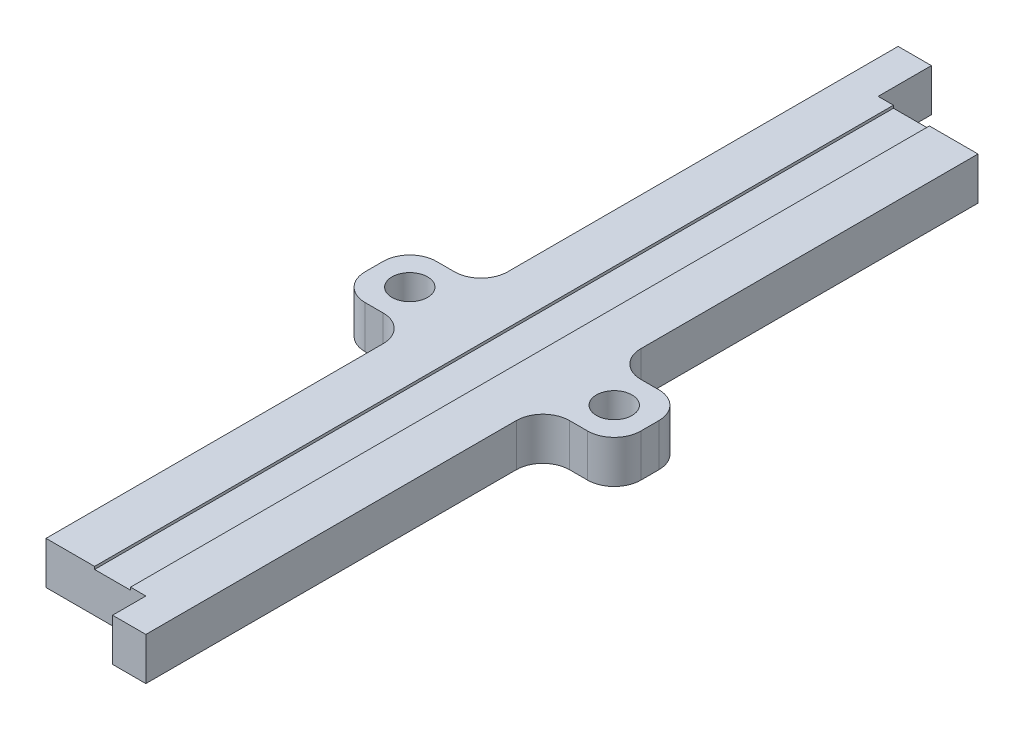
ISO-10303-21;
HEADER;
FILE_DESCRIPTION(('STEP AP214'),'2;1');
FILE_NAME('part.step','',(''),(''),'','','');
FILE_SCHEMA(('AUTOMOTIVE_DESIGN { 1 0 10303 214 1 1 1 1 }'));
ENDSEC;
DATA;
#1=APPLICATION_CONTEXT('core data for automotive mechanical design processes');
#2=APPLICATION_PROTOCOL_DEFINITION('international standard','automotive_design',2000,#1);
#3=PRODUCT_CONTEXT('',#1,'mechanical');
#4=PRODUCT('Part','Part','',(#3));
#5=PRODUCT_RELATED_PRODUCT_CATEGORY('part','',(#4));
#6=PRODUCT_DEFINITION_FORMATION('','',#4);
#7=PRODUCT_DEFINITION_CONTEXT('part definition',#1,'design');
#8=PRODUCT_DEFINITION('design','',#6,#7);
#9=PRODUCT_DEFINITION_SHAPE('','',#8);
#10=(LENGTH_UNIT() NAMED_UNIT(*) SI_UNIT(.MILLI.,.METRE.));
#11=(NAMED_UNIT(*) PLANE_ANGLE_UNIT() SI_UNIT($,.RADIAN.));
#12=(NAMED_UNIT(*) SI_UNIT($,.STERADIAN.) SOLID_ANGLE_UNIT());
#13=UNCERTAINTY_MEASURE_WITH_UNIT(LENGTH_MEASURE(1.E-05),#10,'distance_accuracy_value','');
#14=(GEOMETRIC_REPRESENTATION_CONTEXT(3) GLOBAL_UNCERTAINTY_ASSIGNED_CONTEXT((#13)) GLOBAL_UNIT_ASSIGNED_CONTEXT((#10,
#11,#12)) REPRESENTATION_CONTEXT('',''));
#15=CARTESIAN_POINT('',(0.,0.,0.));
#16=DIRECTION('',(0.,0.,1.));
#17=DIRECTION('',(1.,0.,0.));
#18=AXIS2_PLACEMENT_3D('',#15,#16,#17);
#19=CARTESIAN_POINT('',(6.35,-2.032,228.6));
#20=DIRECTION('',(-1.,0.,0.));
#21=DIRECTION('',(0.,0.,1.));
#22=AXIS2_PLACEMENT_3D('',#19,#20,#21);
#23=PLANE('',#22);
#24=DIRECTION('',(0.,0.,-1.));
#25=VECTOR('',#24,1.);
#26=CARTESIAN_POINT('',(6.35,2.032,228.6));
#27=LINE('',#26,#25);
#28=CARTESIAN_POINT('',(6.35,2.032,108.35894));
#29=VERTEX_POINT('',#28);
#30=CARTESIAN_POINT('',(6.35,2.032,76.2));
#31=VERTEX_POINT('',#30);
#32=EDGE_CURVE('E274',#29,#31,#27,.T.);
#33=ORIENTED_EDGE('',*,*,#32,.F.);
#34=DIRECTION('',(0.,1.,0.));
#35=VECTOR('',#34,1.);
#36=CARTESIAN_POINT('',(6.35,-2.032,108.35894));
#37=LINE('',#36,#35);
#38=CARTESIAN_POINT('',(6.35,-2.032,108.35894));
#39=VERTEX_POINT('',#38);
#40=EDGE_CURVE('E277',#29,#39,#37,.F.);
#41=ORIENTED_EDGE('',*,*,#40,.T.);
#42=DIRECTION('',(0.,0.,-1.));
#43=VECTOR('',#42,1.);
#44=CARTESIAN_POINT('',(6.35,-2.032,228.6));
#45=LINE('',#44,#43);
#46=CARTESIAN_POINT('',(6.35,-2.032,76.2));
#47=VERTEX_POINT('',#46);
#48=EDGE_CURVE('E249',#39,#47,#45,.T.);
#49=ORIENTED_EDGE('',*,*,#48,.T.);
#50=DIRECTION('',(0.,1.,0.));
#51=VECTOR('',#50,1.);
#52=CARTESIAN_POINT('',(6.35,-2.032,76.2));
#53=LINE('',#52,#51);
#54=EDGE_CURVE('E412',#47,#31,#53,.T.);
#55=ORIENTED_EDGE('',*,*,#54,.T.);
#56=EDGE_LOOP('',(#33,#41,#49,#55));
#57=FACE_BOUND('',#56,.T.);
#58=ADVANCED_FACE('F33',(#57),#23,.F.);
#59=CARTESIAN_POINT('',(-6.35,-2.032,228.6));
#60=DIRECTION('',(1.,0.,0.));
#61=DIRECTION('',(0.,0.,-1.));
#62=AXIS2_PLACEMENT_3D('',#59,#60,#61);
#63=PLANE('',#62);
#64=DIRECTION('',(0.,0.,-1.));
#65=VECTOR('',#64,1.);
#66=CARTESIAN_POINT('',(-6.35,2.032,228.6));
#67=LINE('',#66,#65);
#68=CARTESIAN_POINT('',(-6.34999999999997,2.032,152.4));
#69=VERTEX_POINT('',#68);
#70=CARTESIAN_POINT('',(-6.35,2.032,120.24106));
#71=VERTEX_POINT('',#70);
#72=EDGE_CURVE('E276',#69,#71,#67,.T.);
#73=ORIENTED_EDGE('',*,*,#72,.T.);
#74=DIRECTION('',(0.,1.,0.));
#75=VECTOR('',#74,1.);
#76=CARTESIAN_POINT('',(-6.35,-2.032,120.24106));
#77=LINE('',#76,#75);
#78=CARTESIAN_POINT('',(-6.35,-2.032,120.24106));
#79=VERTEX_POINT('',#78);
#80=EDGE_CURVE('E348',#71,#79,#77,.F.);
#81=ORIENTED_EDGE('',*,*,#80,.T.);
#82=DIRECTION('',(0.,0.,-1.));
#83=VECTOR('',#82,1.);
#84=CARTESIAN_POINT('',(-6.35,-2.032,228.6));
#85=LINE('',#84,#83);
#86=CARTESIAN_POINT('',(-6.34999999999997,-2.032,152.4));
#87=VERTEX_POINT('',#86);
#88=EDGE_CURVE('E251',#87,#79,#85,.T.);
#89=ORIENTED_EDGE('',*,*,#88,.F.);
#90=DIRECTION('',(0.,1.,0.));
#91=VECTOR('',#90,1.);
#92=CARTESIAN_POINT('',(-6.34999999999997,-2.032,152.4));
#93=LINE('',#92,#91);
#94=EDGE_CURVE('E381',#87,#69,#93,.T.);
#95=ORIENTED_EDGE('',*,*,#94,.T.);
#96=EDGE_LOOP('',(#73,#81,#89,#95));
#97=FACE_BOUND('',#96,.T.);
#98=ADVANCED_FACE('F551',(#97),#63,.F.);
#99=CARTESIAN_POINT('',(-6.35,2.032,228.6));
#100=DIRECTION('',(0.,-1.,0.));
#101=DIRECTION('',(0.,0.,-1.));
#102=AXIS2_PLACEMENT_3D('',#99,#100,#101);
#103=PLANE('',#102);
#104=DIRECTION('',(0.,0.,1.));
#105=VECTOR('',#104,1.);
#106=CARTESIAN_POINT('',(-13.1521199999999,2.032,0.));
#107=LINE('',#106,#105);
#108=CARTESIAN_POINT('',(-13.15212,2.032,113.43894));
#109=VERTEX_POINT('',#108);
#110=CARTESIAN_POINT('',(-13.15212,2.032,115.16106));
#111=VERTEX_POINT('',#110);
#112=EDGE_CURVE('E302',#109,#111,#107,.T.);
#113=ORIENTED_EDGE('',*,*,#112,.T.);
#114=CARTESIAN_POINT('',(-10.61212,2.032,115.16106));
#115=DIRECTION('',(0.,-1.,0.));
#116=DIRECTION('',(0.,0.,-1.));
#117=AXIS2_PLACEMENT_3D('',#114,#115,#116);
#118=CIRCLE('',#117,2.54);
#119=CARTESIAN_POINT('',(-10.61212,2.032,117.70106));
#120=VERTEX_POINT('',#119);
#121=EDGE_CURVE('E306',#111,#120,#118,.F.);
#122=ORIENTED_EDGE('',*,*,#121,.T.);
#123=DIRECTION('',(-1.,0.,0.));
#124=VECTOR('',#123,1.);
#125=CARTESIAN_POINT('',(0.,2.032,117.70106));
#126=LINE('',#125,#124);
#127=CARTESIAN_POINT('',(-8.89,2.032,117.70106));
#128=VERTEX_POINT('',#127);
#129=EDGE_CURVE('E367',#128,#120,#126,.T.);
#130=ORIENTED_EDGE('',*,*,#129,.F.);
#131=CARTESIAN_POINT('',(-8.89,2.032,120.24106));
#132=DIRECTION('',(0.,-1.,0.));
#133=DIRECTION('',(0.,0.,-1.));
#134=AXIS2_PLACEMENT_3D('',#131,#132,#133);
#135=CIRCLE('',#134,2.54);
#136=EDGE_CURVE('E323',#128,#71,#135,.T.);
#137=ORIENTED_EDGE('',*,*,#136,.T.);
#138=ORIENTED_EDGE('',*,*,#72,.F.);
#139=DIRECTION('',(-1.,0.,0.));
#140=VECTOR('',#139,1.);
#141=CARTESIAN_POINT('',(-6.34999999999997,2.032,152.4));
#142=LINE('',#141,#140);
#143=CARTESIAN_POINT('',(-1.7145,2.032,152.4));
#144=VERTEX_POINT('',#143);
#145=EDGE_CURVE('E379',#144,#69,#142,.T.);
#146=ORIENTED_EDGE('',*,*,#145,.F.);
#147=DIRECTION('',(0.,0.,1.));
#148=VECTOR('',#147,1.);
#149=CARTESIAN_POINT('',(-1.7145,2.032,5.6134));
#150=LINE('',#149,#148);
#151=CARTESIAN_POINT('',(-1.7145,2.032,76.2));
#152=VERTEX_POINT('',#151);
#153=EDGE_CURVE('E427',#152,#144,#150,.T.);
#154=ORIENTED_EDGE('',*,*,#153,.F.);
#155=DIRECTION('',(1.,0.,0.));
#156=VECTOR('',#155,1.);
#157=CARTESIAN_POINT('',(-3.17499999999998,2.032,76.2));
#158=LINE('',#157,#156);
#159=CARTESIAN_POINT('',(-3.17499999999998,2.032,76.2));
#160=VERTEX_POINT('',#159);
#161=EDGE_CURVE('E398',#160,#152,#158,.T.);
#162=ORIENTED_EDGE('',*,*,#161,.F.);
#163=DIRECTION('',(0.,0.,1.));
#164=VECTOR('',#163,1.);
#165=CARTESIAN_POINT('',(-3.17499999999998,2.032,71.12));
#166=LINE('',#165,#164);
#167=CARTESIAN_POINT('',(-3.17499999999998,2.032,71.12));
#168=VERTEX_POINT('',#167);
#169=EDGE_CURVE('E407',#168,#160,#166,.T.);
#170=ORIENTED_EDGE('',*,*,#169,.F.);
#171=DIRECTION('',(1.,0.,0.));
#172=VECTOR('',#171,1.);
#173=CARTESIAN_POINT('',(-6.34999999999998,2.032,71.12));
#174=LINE('',#173,#172);
#175=CARTESIAN_POINT('',(-6.34999999999998,2.032,71.12));
#176=VERTEX_POINT('',#175);
#177=EDGE_CURVE('E393',#176,#168,#174,.T.);
#178=ORIENTED_EDGE('',*,*,#177,.F.);
#179=CARTESIAN_POINT('',(-6.35,2.032,108.35894));
#180=VERTEX_POINT('',#179);
#181=EDGE_CURVE('E291',#180,#176,#67,.T.);
#182=ORIENTED_EDGE('',*,*,#181,.F.);
#183=CARTESIAN_POINT('',(-8.89,2.032,108.35894));
#184=DIRECTION('',(0.,-1.,0.));
#185=DIRECTION('',(0.,0.,-1.));
#186=AXIS2_PLACEMENT_3D('',#183,#184,#185);
#187=CIRCLE('',#186,2.54);
#188=CARTESIAN_POINT('',(-8.89,2.032,110.89894));
#189=VERTEX_POINT('',#188);
#190=EDGE_CURVE('E41',#180,#189,#187,.T.);
#191=ORIENTED_EDGE('',*,*,#190,.T.);
#192=DIRECTION('',(-1.,0.,0.));
#193=VECTOR('',#192,1.);
#194=CARTESIAN_POINT('',(0.,2.032,110.89894));
#195=LINE('',#194,#193);
#196=CARTESIAN_POINT('',(-10.61212,2.032,110.89894));
#197=VERTEX_POINT('',#196);
#198=EDGE_CURVE('E299',#189,#197,#195,.T.);
#199=ORIENTED_EDGE('',*,*,#198,.T.);
#200=CARTESIAN_POINT('',(-10.61212,2.032,113.43894));
#201=DIRECTION('',(0.,-1.,0.));
#202=DIRECTION('',(0.,0.,-1.));
#203=AXIS2_PLACEMENT_3D('',#200,#201,#202);
#204=CIRCLE('',#203,2.54);
#205=EDGE_CURVE('E48',#197,#109,#204,.F.);
#206=ORIENTED_EDGE('',*,*,#205,.T.);
#207=EDGE_LOOP('',(#113,#122,#130,#137,#138,#146,#154,#162,#170,#178,#182,#191,#199,#206));
#208=FACE_BOUND('',#207,.T.);
#209=CARTESIAN_POINT('',(-9.75105999999997,2.032,114.3));
#210=DIRECTION('',(0.,1.,0.));
#211=DIRECTION('',(0.,0.,1.));
#212=AXIS2_PLACEMENT_3D('',#209,#210,#211);
#213=CIRCLE('',#212,1.70052999999999);
#214=CARTESIAN_POINT('',(-9.75105999999997,2.032,116.00053));
#215=VERTEX_POINT('',#214);
#216=EDGE_CURVE('E303',#215,#215,#213,.T.);
#217=ORIENTED_EDGE('',*,*,#216,.F.);
#218=EDGE_LOOP('',(#217));
#219=FACE_BOUND('',#218,.T.);
#220=ADVANCED_FACE('F365',(#208,#219),#103,.F.);
#221=DIRECTION('',(0.,0.,1.));
#222=VECTOR('',#221,1.);
#223=CARTESIAN_POINT('',(13.1521199999999,2.032,0.));
#224=LINE('',#223,#222);
#225=CARTESIAN_POINT('',(13.15212,2.032,113.43894));
#226=VERTEX_POINT('',#225);
#227=CARTESIAN_POINT('',(13.15212,2.032,115.16106));
#228=VERTEX_POINT('',#227);
#229=EDGE_CURVE('E510',#226,#228,#224,.T.);
#230=ORIENTED_EDGE('',*,*,#229,.F.);
#231=CARTESIAN_POINT('',(10.61212,2.032,113.43894));
#232=DIRECTION('',(0.,-1.,0.));
#233=DIRECTION('',(0.,0.,-1.));
#234=AXIS2_PLACEMENT_3D('',#231,#232,#233);
#235=CIRCLE('',#234,2.54);
#236=CARTESIAN_POINT('',(10.61212,2.032,110.89894));
#237=VERTEX_POINT('',#236);
#238=EDGE_CURVE('E485',#226,#237,#235,.F.);
#239=ORIENTED_EDGE('',*,*,#238,.T.);
#240=DIRECTION('',(1.,0.,0.));
#241=VECTOR('',#240,1.);
#242=CARTESIAN_POINT('',(0.,2.032,110.89894));
#243=LINE('',#242,#241);
#244=CARTESIAN_POINT('',(8.89,2.032,110.89894));
#245=VERTEX_POINT('',#244);
#246=EDGE_CURVE('E472',#245,#237,#243,.T.);
#247=ORIENTED_EDGE('',*,*,#246,.F.);
#248=CARTESIAN_POINT('',(8.89,2.032,108.35894));
#249=DIRECTION('',(0.,-1.,0.));
#250=DIRECTION('',(0.,0.,-1.));
#251=AXIS2_PLACEMENT_3D('',#248,#249,#250);
#252=CIRCLE('',#251,2.54);
#253=EDGE_CURVE('E316',#245,#29,#252,.T.);
#254=ORIENTED_EDGE('',*,*,#253,.T.);
#255=ORIENTED_EDGE('',*,*,#32,.T.);
#256=CARTESIAN_POINT('',(1.7145,2.032,76.2));
#257=VERTEX_POINT('',#256);
#258=EDGE_CURVE('E410',#257,#31,#158,.T.);
#259=ORIENTED_EDGE('',*,*,#258,.F.);
#260=DIRECTION('',(0.,0.,-1.));
#261=VECTOR('',#260,1.);
#262=CARTESIAN_POINT('',(1.7145,2.032,5.61339999999999));
#263=LINE('',#262,#261);
#264=CARTESIAN_POINT('',(1.7145,2.032,152.4));
#265=VERTEX_POINT('',#264);
#266=EDGE_CURVE('E265',#265,#257,#263,.T.);
#267=ORIENTED_EDGE('',*,*,#266,.F.);
#268=CARTESIAN_POINT('',(3.17499999999999,2.032,152.4));
#269=VERTEX_POINT('',#268);
#270=EDGE_CURVE('E229',#269,#265,#142,.T.);
#271=ORIENTED_EDGE('',*,*,#270,.F.);
#272=DIRECTION('',(0.,0.,-1.));
#273=VECTOR('',#272,1.);
#274=CARTESIAN_POINT('',(3.17499999999999,2.032,152.4));
#275=LINE('',#274,#273);
#276=CARTESIAN_POINT('',(3.17499999999999,2.032,155.575));
#277=VERTEX_POINT('',#276);
#278=EDGE_CURVE('E376',#277,#269,#275,.T.);
#279=ORIENTED_EDGE('',*,*,#278,.F.);
#280=DIRECTION('',(-1.,0.,0.));
#281=VECTOR('',#280,1.);
#282=CARTESIAN_POINT('',(3.17499999999999,2.032,155.575));
#283=LINE('',#282,#281);
#284=CARTESIAN_POINT('',(6.34999999999999,2.032,155.575));
#285=VERTEX_POINT('',#284);
#286=EDGE_CURVE('E344',#285,#277,#283,.T.);
#287=ORIENTED_EDGE('',*,*,#286,.F.);
#288=CARTESIAN_POINT('',(6.35,2.032,120.24106));
#289=VERTEX_POINT('',#288);
#290=EDGE_CURVE('E239',#285,#289,#27,.T.);
#291=ORIENTED_EDGE('',*,*,#290,.T.);
#292=CARTESIAN_POINT('',(8.89,2.032,120.24106));
#293=DIRECTION('',(0.,-1.,0.));
#294=DIRECTION('',(0.,0.,-1.));
#295=AXIS2_PLACEMENT_3D('',#292,#293,#294);
#296=CIRCLE('',#295,2.54);
#297=CARTESIAN_POINT('',(8.89,2.032,117.70106));
#298=VERTEX_POINT('',#297);
#299=EDGE_CURVE('E320',#289,#298,#296,.T.);
#300=ORIENTED_EDGE('',*,*,#299,.T.);
#301=DIRECTION('',(1.,0.,0.));
#302=VECTOR('',#301,1.);
#303=CARTESIAN_POINT('',(0.,2.032,117.70106));
#304=LINE('',#303,#302);
#305=CARTESIAN_POINT('',(10.61212,2.032,117.70106));
#306=VERTEX_POINT('',#305);
#307=EDGE_CURVE('E513',#298,#306,#304,.T.);
#308=ORIENTED_EDGE('',*,*,#307,.T.);
#309=CARTESIAN_POINT('',(10.61212,2.032,115.16106));
#310=DIRECTION('',(0.,-1.,0.));
#311=DIRECTION('',(0.,0.,-1.));
#312=AXIS2_PLACEMENT_3D('',#309,#310,#311);
#313=CIRCLE('',#312,2.54);
#314=EDGE_CURVE('E528',#306,#228,#313,.F.);
#315=ORIENTED_EDGE('',*,*,#314,.T.);
#316=EDGE_LOOP('',(#230,#239,#247,#254,#255,#259,#267,#271,#279,#287,#291,#300,#308,#315));
#317=FACE_BOUND('',#316,.T.);
#318=CARTESIAN_POINT('',(9.75105999999997,2.032,114.3));
#319=DIRECTION('',(0.,1.,0.));
#320=DIRECTION('',(0.,0.,1.));
#321=AXIS2_PLACEMENT_3D('',#318,#319,#320);
#322=CIRCLE('',#321,1.70052999999999);
#323=CARTESIAN_POINT('',(9.75105999999997,2.032,116.00053));
#324=VERTEX_POINT('',#323);
#325=EDGE_CURVE('E471',#324,#324,#322,.F.);
#326=ORIENTED_EDGE('',*,*,#325,.T.);
#327=EDGE_LOOP('',(#326));
#328=FACE_BOUND('',#327,.T.);
#329=ADVANCED_FACE('F448',(#317,#328),#103,.F.);
#330=CARTESIAN_POINT('',(-6.35,-2.032,228.6));
#331=DIRECTION('',(0.,1.,0.));
#332=DIRECTION('',(0.,0.,1.));
#333=AXIS2_PLACEMENT_3D('',#330,#331,#332);
#334=PLANE('',#333);
#335=DIRECTION('',(1.,0.,0.));
#336=VECTOR('',#335,1.);
#337=CARTESIAN_POINT('',(0.,-2.032,110.89894));
#338=LINE('',#337,#336);
#339=CARTESIAN_POINT('',(8.89,-2.032,110.89894));
#340=VERTEX_POINT('',#339);
#341=CARTESIAN_POINT('',(10.61212,-2.032,110.89894));
#342=VERTEX_POINT('',#341);
#343=EDGE_CURVE('E467',#340,#342,#338,.T.);
#344=ORIENTED_EDGE('',*,*,#343,.T.);
#345=CARTESIAN_POINT('',(10.61212,-2.032,113.43894));
#346=DIRECTION('',(0.,1.,0.));
#347=DIRECTION('',(0.,0.,1.));
#348=AXIS2_PLACEMENT_3D('',#345,#346,#347);
#349=CIRCLE('',#348,2.54);
#350=CARTESIAN_POINT('',(13.15212,-2.032,113.43894));
#351=VERTEX_POINT('',#350);
#352=EDGE_CURVE('E489',#342,#351,#349,.F.);
#353=ORIENTED_EDGE('',*,*,#352,.T.);
#354=DIRECTION('',(0.,0.,1.));
#355=VECTOR('',#354,1.);
#356=CARTESIAN_POINT('',(13.1521199999999,-2.032,0.));
#357=LINE('',#356,#355);
#358=CARTESIAN_POINT('',(13.15212,-2.032,115.16106));
#359=VERTEX_POINT('',#358);
#360=EDGE_CURVE('E480',#351,#359,#357,.T.);
#361=ORIENTED_EDGE('',*,*,#360,.T.);
#362=CARTESIAN_POINT('',(10.61212,-2.032,115.16106));
#363=DIRECTION('',(0.,1.,0.));
#364=DIRECTION('',(0.,0.,1.));
#365=AXIS2_PLACEMENT_3D('',#362,#363,#364);
#366=CIRCLE('',#365,2.54);
#367=CARTESIAN_POINT('',(10.61212,-2.032,117.70106));
#368=VERTEX_POINT('',#367);
#369=EDGE_CURVE('E487',#359,#368,#366,.F.);
#370=ORIENTED_EDGE('',*,*,#369,.T.);
#371=DIRECTION('',(1.,0.,0.));
#372=VECTOR('',#371,1.);
#373=CARTESIAN_POINT('',(0.,-2.032,117.70106));
#374=LINE('',#373,#372);
#375=CARTESIAN_POINT('',(8.89,-2.032,117.70106));
#376=VERTEX_POINT('',#375);
#377=EDGE_CURVE('E470',#376,#368,#374,.T.);
#378=ORIENTED_EDGE('',*,*,#377,.F.);
#379=CARTESIAN_POINT('',(8.89,-2.032,120.24106));
#380=DIRECTION('',(0.,1.,0.));
#381=DIRECTION('',(0.,0.,1.));
#382=AXIS2_PLACEMENT_3D('',#379,#380,#381);
#383=CIRCLE('',#382,2.54);
#384=CARTESIAN_POINT('',(6.35,-2.032,120.24106));
#385=VERTEX_POINT('',#384);
#386=EDGE_CURVE('E247',#376,#385,#383,.T.);
#387=ORIENTED_EDGE('',*,*,#386,.T.);
#388=CARTESIAN_POINT('',(6.34999999999999,-2.032,155.575));
#389=VERTEX_POINT('',#388);
#390=EDGE_CURVE('E236',#389,#385,#45,.T.);
#391=ORIENTED_EDGE('',*,*,#390,.F.);
#392=DIRECTION('',(-1.,0.,0.));
#393=VECTOR('',#392,1.);
#394=CARTESIAN_POINT('',(3.17499999999999,-2.032,155.575));
#395=LINE('',#394,#393);
#396=CARTESIAN_POINT('',(3.17499999999999,-2.032,155.575));
#397=VERTEX_POINT('',#396);
#398=EDGE_CURVE('E217',#389,#397,#395,.T.);
#399=ORIENTED_EDGE('',*,*,#398,.T.);
#400=DIRECTION('',(0.,0.,-1.));
#401=VECTOR('',#400,1.);
#402=CARTESIAN_POINT('',(3.17499999999999,-2.032,152.4));
#403=LINE('',#402,#401);
#404=CARTESIAN_POINT('',(3.17499999999999,-2.032,152.4));
#405=VERTEX_POINT('',#404);
#406=EDGE_CURVE('E228',#397,#405,#403,.T.);
#407=ORIENTED_EDGE('',*,*,#406,.T.);
#408=DIRECTION('',(-1.,0.,0.));
#409=VECTOR('',#408,1.);
#410=CARTESIAN_POINT('',(-6.34999999999997,-2.032,152.4));
#411=LINE('',#410,#409);
#412=EDGE_CURVE('E240',#405,#87,#411,.T.);
#413=ORIENTED_EDGE('',*,*,#412,.T.);
#414=ORIENTED_EDGE('',*,*,#88,.T.);
#415=CARTESIAN_POINT('',(-8.89,-2.032,120.24106));
#416=DIRECTION('',(0.,1.,0.));
#417=DIRECTION('',(0.,0.,1.));
#418=AXIS2_PLACEMENT_3D('',#415,#416,#417);
#419=CIRCLE('',#418,2.54);
#420=CARTESIAN_POINT('',(-8.89,-2.032,117.70106));
#421=VERTEX_POINT('',#420);
#422=EDGE_CURVE('E325',#79,#421,#419,.T.);
#423=ORIENTED_EDGE('',*,*,#422,.T.);
#424=DIRECTION('',(-1.,0.,0.));
#425=VECTOR('',#424,1.);
#426=CARTESIAN_POINT('',(0.,-2.032,117.70106));
#427=LINE('',#426,#425);
#428=CARTESIAN_POINT('',(-10.61212,-2.032,117.70106));
#429=VERTEX_POINT('',#428);
#430=EDGE_CURVE('E329',#421,#429,#427,.T.);
#431=ORIENTED_EDGE('',*,*,#430,.T.);
#432=CARTESIAN_POINT('',(-10.61212,-2.032,115.16106));
#433=DIRECTION('',(0.,1.,0.));
#434=DIRECTION('',(0.,0.,1.));
#435=AXIS2_PLACEMENT_3D('',#432,#433,#434);
#436=CIRCLE('',#435,2.54);
#437=CARTESIAN_POINT('',(-13.15212,-2.032,115.16106));
#438=VERTEX_POINT('',#437);
#439=EDGE_CURVE('E484',#429,#438,#436,.F.);
#440=ORIENTED_EDGE('',*,*,#439,.T.);
#441=DIRECTION('',(0.,0.,1.));
#442=VECTOR('',#441,1.);
#443=CARTESIAN_POINT('',(-13.1521199999999,-2.032,0.));
#444=LINE('',#443,#442);
#445=CARTESIAN_POINT('',(-13.15212,-2.032,113.43894));
#446=VERTEX_POINT('',#445);
#447=EDGE_CURVE('E345',#446,#438,#444,.T.);
#448=ORIENTED_EDGE('',*,*,#447,.F.);
#449=CARTESIAN_POINT('',(-10.61212,-2.032,113.43894));
#450=DIRECTION('',(0.,1.,0.));
#451=DIRECTION('',(0.,0.,1.));
#452=AXIS2_PLACEMENT_3D('',#449,#450,#451);
#453=CIRCLE('',#452,2.54);
#454=CARTESIAN_POINT('',(-10.61212,-2.032,110.89894));
#455=VERTEX_POINT('',#454);
#456=EDGE_CURVE('E482',#446,#455,#453,.F.);
#457=ORIENTED_EDGE('',*,*,#456,.T.);
#458=DIRECTION('',(-1.,0.,0.));
#459=VECTOR('',#458,1.);
#460=CARTESIAN_POINT('',(0.,-2.032,110.89894));
#461=LINE('',#460,#459);
#462=CARTESIAN_POINT('',(-8.89,-2.032,110.89894));
#463=VERTEX_POINT('',#462);
#464=EDGE_CURVE('E500',#463,#455,#461,.T.);
#465=ORIENTED_EDGE('',*,*,#464,.F.);
#466=CARTESIAN_POINT('',(-8.89,-2.032,108.35894));
#467=DIRECTION('',(0.,1.,0.));
#468=DIRECTION('',(0.,0.,1.));
#469=AXIS2_PLACEMENT_3D('',#466,#467,#468);
#470=CIRCLE('',#469,2.54);
#471=CARTESIAN_POINT('',(-6.35,-2.032,108.35894));
#472=VERTEX_POINT('',#471);
#473=EDGE_CURVE('E11',#463,#472,#470,.T.);
#474=ORIENTED_EDGE('',*,*,#473,.T.);
#475=CARTESIAN_POINT('',(-6.34999999999998,-2.032,71.12));
#476=VERTEX_POINT('',#475);
#477=EDGE_CURVE('E248',#472,#476,#85,.T.);
#478=ORIENTED_EDGE('',*,*,#477,.T.);
#479=DIRECTION('',(1.,0.,0.));
#480=VECTOR('',#479,1.);
#481=CARTESIAN_POINT('',(-6.34999999999998,-2.032,71.12));
#482=LINE('',#481,#480);
#483=CARTESIAN_POINT('',(-3.17499999999998,-2.032,71.12));
#484=VERTEX_POINT('',#483);
#485=EDGE_CURVE('E394',#476,#484,#482,.T.);
#486=ORIENTED_EDGE('',*,*,#485,.T.);
#487=DIRECTION('',(0.,0.,1.));
#488=VECTOR('',#487,1.);
#489=CARTESIAN_POINT('',(-3.17499999999998,-2.032,71.12));
#490=LINE('',#489,#488);
#491=CARTESIAN_POINT('',(-3.17499999999998,-2.032,76.2));
#492=VERTEX_POINT('',#491);
#493=EDGE_CURVE('E397',#484,#492,#490,.T.);
#494=ORIENTED_EDGE('',*,*,#493,.T.);
#495=DIRECTION('',(1.,0.,0.));
#496=VECTOR('',#495,1.);
#497=CARTESIAN_POINT('',(-3.17499999999998,-2.032,76.2));
#498=LINE('',#497,#496);
#499=EDGE_CURVE('E401',#492,#47,#498,.T.);
#500=ORIENTED_EDGE('',*,*,#499,.T.);
#501=ORIENTED_EDGE('',*,*,#48,.F.);
#502=CARTESIAN_POINT('',(8.89,-2.032,108.35894));
#503=DIRECTION('',(0.,1.,0.));
#504=DIRECTION('',(0.,0.,1.));
#505=AXIS2_PLACEMENT_3D('',#502,#503,#504);
#506=CIRCLE('',#505,2.54);
#507=EDGE_CURVE('E318',#39,#340,#506,.T.);
#508=ORIENTED_EDGE('',*,*,#507,.T.);
#509=EDGE_LOOP('',(#344,#353,#361,#370,#378,#387,#391,#399,#407,#413,#414,#423,#431,#440,#448,
#457,#465,#474,#478,#486,#494,#500,#501,#508));
#510=FACE_BOUND('',#509,.T.);
#511=CARTESIAN_POINT('',(-9.75105999999997,-2.032,114.3));
#512=DIRECTION('',(0.,1.,0.));
#513=DIRECTION('',(0.,0.,1.));
#514=AXIS2_PLACEMENT_3D('',#511,#512,#513);
#515=CIRCLE('',#514,1.70052999999999);
#516=CARTESIAN_POINT('',(-9.75105999999997,-2.032,116.00053));
#517=VERTEX_POINT('',#516);
#518=EDGE_CURVE('E369',#517,#517,#515,.T.);
#519=ORIENTED_EDGE('',*,*,#518,.T.);
#520=EDGE_LOOP('',(#519));
#521=FACE_BOUND('',#520,.T.);
#522=CARTESIAN_POINT('',(9.75105999999997,-2.032,114.3));
#523=DIRECTION('',(0.,1.,0.));
#524=DIRECTION('',(0.,0.,1.));
#525=AXIS2_PLACEMENT_3D('',#522,#523,#524);
#526=CIRCLE('',#525,1.70052999999999);
#527=CARTESIAN_POINT('',(9.75105999999997,-2.032,116.00053));
#528=VERTEX_POINT('',#527);
#529=EDGE_CURVE('E514',#528,#528,#526,.F.);
#530=ORIENTED_EDGE('',*,*,#529,.F.);
#531=EDGE_LOOP('',(#530));
#532=FACE_BOUND('',#531,.T.);
#533=ADVANCED_FACE('F243',(#510,#521,#532),#334,.F.);
#534=ORIENTED_EDGE('',*,*,#390,.T.);
#535=DIRECTION('',(0.,1.,0.));
#536=VECTOR('',#535,1.);
#537=CARTESIAN_POINT('',(6.35,-2.032,120.24106));
#538=LINE('',#537,#536);
#539=EDGE_CURVE('E352',#385,#289,#538,.T.);
#540=ORIENTED_EDGE('',*,*,#539,.T.);
#541=ORIENTED_EDGE('',*,*,#290,.F.);
#542=DIRECTION('',(0.,1.,0.));
#543=VECTOR('',#542,1.);
#544=CARTESIAN_POINT('',(6.34999999999999,-2.032,155.575));
#545=LINE('',#544,#543);
#546=EDGE_CURVE('E221',#389,#285,#545,.T.);
#547=ORIENTED_EDGE('',*,*,#546,.F.);
#548=EDGE_LOOP('',(#534,#540,#541,#547));
#549=FACE_BOUND('',#548,.T.);
#550=ADVANCED_FACE('F234',(#549),#23,.F.);
#551=ORIENTED_EDGE('',*,*,#477,.F.);
#552=DIRECTION('',(0.,1.,0.));
#553=VECTOR('',#552,1.);
#554=CARTESIAN_POINT('',(-6.35,-2.032,108.35894));
#555=LINE('',#554,#553);
#556=EDGE_CURVE('E313',#472,#180,#555,.T.);
#557=ORIENTED_EDGE('',*,*,#556,.T.);
#558=ORIENTED_EDGE('',*,*,#181,.T.);
#559=DIRECTION('',(0.,1.,0.));
#560=VECTOR('',#559,1.);
#561=CARTESIAN_POINT('',(-6.34999999999998,-2.032,71.12));
#562=LINE('',#561,#560);
#563=EDGE_CURVE('E404',#476,#176,#562,.T.);
#564=ORIENTED_EDGE('',*,*,#563,.F.);
#565=EDGE_LOOP('',(#551,#557,#558,#564));
#566=FACE_BOUND('',#565,.T.);
#567=ADVANCED_FACE('F559',(#566),#63,.F.);
#568=CARTESIAN_POINT('',(-1.7145,1.778,5.6134));
#569=DIRECTION('',(-1.,0.,0.));
#570=DIRECTION('',(0.,0.,1.));
#571=AXIS2_PLACEMENT_3D('',#568,#569,#570);
#572=PLANE('',#571);
#573=ORIENTED_EDGE('',*,*,#153,.T.);
#574=DIRECTION('',(0.,-1.,0.));
#575=VECTOR('',#574,1.);
#576=CARTESIAN_POINT('',(-1.7145,1.778,152.4));
#577=LINE('',#576,#575);
#578=CARTESIAN_POINT('',(-1.7145,1.778,152.4));
#579=VERTEX_POINT('',#578);
#580=EDGE_CURVE('E390',#144,#579,#577,.T.);
#581=ORIENTED_EDGE('',*,*,#580,.T.);
#582=DIRECTION('',(0.,0.,1.));
#583=VECTOR('',#582,1.);
#584=CARTESIAN_POINT('',(-1.7145,1.778,5.6134));
#585=LINE('',#584,#583);
#586=CARTESIAN_POINT('',(-1.7145,1.778,76.2));
#587=VERTEX_POINT('',#586);
#588=EDGE_CURVE('E428',#587,#579,#585,.T.);
#589=ORIENTED_EDGE('',*,*,#588,.F.);
#590=DIRECTION('',(0.,1.,0.));
#591=VECTOR('',#590,1.);
#592=CARTESIAN_POINT('',(-1.7145,1.778,76.2));
#593=LINE('',#592,#591);
#594=EDGE_CURVE('E424',#587,#152,#593,.T.);
#595=ORIENTED_EDGE('',*,*,#594,.T.);
#596=EDGE_LOOP('',(#573,#581,#589,#595));
#597=FACE_BOUND('',#596,.T.);
#598=ADVANCED_FACE('F566',(#597),#572,.F.);
#599=CARTESIAN_POINT('',(1.7145,1.778,5.61339999999999));
#600=DIRECTION('',(1.,0.,0.));
#601=DIRECTION('',(0.,0.,-1.));
#602=AXIS2_PLACEMENT_3D('',#599,#600,#601);
#603=PLANE('',#602);
#604=DIRECTION('',(0.,0.,-1.));
#605=VECTOR('',#604,1.);
#606=CARTESIAN_POINT('',(1.7145,1.778,5.61339999999999));
#607=LINE('',#606,#605);
#608=CARTESIAN_POINT('',(1.7145,1.778,152.4));
#609=VERTEX_POINT('',#608);
#610=CARTESIAN_POINT('',(1.7145,1.778,76.2));
#611=VERTEX_POINT('',#610);
#612=EDGE_CURVE('E253',#609,#611,#607,.T.);
#613=ORIENTED_EDGE('',*,*,#612,.F.);
#614=DIRECTION('',(0.,1.,0.));
#615=VECTOR('',#614,1.);
#616=CARTESIAN_POINT('',(1.7145,1.778,152.4));
#617=LINE('',#616,#615);
#618=EDGE_CURVE('E384',#609,#265,#617,.T.);
#619=ORIENTED_EDGE('',*,*,#618,.T.);
#620=ORIENTED_EDGE('',*,*,#266,.T.);
#621=DIRECTION('',(0.,-1.,0.));
#622=VECTOR('',#621,1.);
#623=CARTESIAN_POINT('',(1.7145,1.778,76.2));
#624=LINE('',#623,#622);
#625=EDGE_CURVE('E415',#257,#611,#624,.T.);
#626=ORIENTED_EDGE('',*,*,#625,.T.);
#627=EDGE_LOOP('',(#613,#619,#620,#626));
#628=FACE_BOUND('',#627,.T.);
#629=ADVANCED_FACE('F438',(#628),#603,.F.);
#630=CARTESIAN_POINT('',(0.,1.778,0.));
#631=DIRECTION('',(0.,1.,0.));
#632=DIRECTION('',(0.,0.,1.));
#633=AXIS2_PLACEMENT_3D('',#630,#631,#632);
#634=PLANE('',#633);
#635=DIRECTION('',(-1.,0.,0.));
#636=VECTOR('',#635,1.);
#637=CARTESIAN_POINT('',(0.,1.778,152.4));
#638=LINE('',#637,#636);
#639=EDGE_CURVE('E286',#609,#579,#638,.T.);
#640=ORIENTED_EDGE('',*,*,#639,.F.);
#641=ORIENTED_EDGE('',*,*,#612,.T.);
#642=DIRECTION('',(1.,0.,0.));
#643=VECTOR('',#642,1.);
#644=CARTESIAN_POINT('',(0.,1.778,76.2));
#645=LINE('',#644,#643);
#646=EDGE_CURVE('E282',#587,#611,#645,.T.);
#647=ORIENTED_EDGE('',*,*,#646,.F.);
#648=ORIENTED_EDGE('',*,*,#588,.T.);
#649=EDGE_LOOP('',(#640,#641,#647,#648));
#650=FACE_BOUND('',#649,.T.);
#651=ADVANCED_FACE('F578',(#650),#634,.T.);
#652=CARTESIAN_POINT('',(-3.17499999999998,-2.032,76.2));
#653=DIRECTION('',(0.,0.,1.));
#654=DIRECTION('',(1.,0.,0.));
#655=AXIS2_PLACEMENT_3D('',#652,#653,#654);
#656=PLANE('',#655);
#657=ORIENTED_EDGE('',*,*,#646,.T.);
#658=ORIENTED_EDGE('',*,*,#625,.F.);
#659=ORIENTED_EDGE('',*,*,#258,.T.);
#660=ORIENTED_EDGE('',*,*,#54,.F.);
#661=ORIENTED_EDGE('',*,*,#499,.F.);
#662=DIRECTION('',(0.,1.,0.));
#663=VECTOR('',#662,1.);
#664=CARTESIAN_POINT('',(-3.17499999999998,-2.032,76.2));
#665=LINE('',#664,#663);
#666=EDGE_CURVE('E416',#492,#160,#665,.T.);
#667=ORIENTED_EDGE('',*,*,#666,.T.);
#668=ORIENTED_EDGE('',*,*,#161,.T.);
#669=ORIENTED_EDGE('',*,*,#594,.F.);
#670=EDGE_LOOP('',(#657,#658,#659,#660,#661,#667,#668,#669));
#671=FACE_BOUND('',#670,.T.);
#672=ADVANCED_FACE('F444',(#671),#656,.F.);
#673=CARTESIAN_POINT('',(-3.17499999999998,-2.032,71.12));
#674=DIRECTION('',(-1.,0.,0.));
#675=DIRECTION('',(0.,0.,1.));
#676=AXIS2_PLACEMENT_3D('',#673,#674,#675);
#677=PLANE('',#676);
#678=ORIENTED_EDGE('',*,*,#169,.T.);
#679=ORIENTED_EDGE('',*,*,#666,.F.);
#680=ORIENTED_EDGE('',*,*,#493,.F.);
#681=DIRECTION('',(0.,1.,0.));
#682=VECTOR('',#681,1.);
#683=CARTESIAN_POINT('',(-3.17499999999998,-2.032,71.12));
#684=LINE('',#683,#682);
#685=EDGE_CURVE('E418',#484,#168,#684,.T.);
#686=ORIENTED_EDGE('',*,*,#685,.T.);
#687=EDGE_LOOP('',(#678,#679,#680,#686));
#688=FACE_BOUND('',#687,.T.);
#689=ADVANCED_FACE('F586',(#688),#677,.F.);
#690=CARTESIAN_POINT('',(-6.34999999999998,-2.032,71.12));
#691=DIRECTION('',(0.,0.,1.));
#692=DIRECTION('',(1.,0.,0.));
#693=AXIS2_PLACEMENT_3D('',#690,#691,#692);
#694=PLANE('',#693);
#695=ORIENTED_EDGE('',*,*,#177,.T.);
#696=ORIENTED_EDGE('',*,*,#685,.F.);
#697=ORIENTED_EDGE('',*,*,#485,.F.);
#698=ORIENTED_EDGE('',*,*,#563,.T.);
#699=EDGE_LOOP('',(#695,#696,#697,#698));
#700=FACE_BOUND('',#699,.T.);
#701=ADVANCED_FACE('F582',(#700),#694,.F.);
#702=CARTESIAN_POINT('',(-6.34999999999997,-2.032,152.4));
#703=DIRECTION('',(0.,0.,-1.));
#704=DIRECTION('',(-1.,0.,0.));
#705=AXIS2_PLACEMENT_3D('',#702,#703,#704);
#706=PLANE('',#705);
#707=ORIENTED_EDGE('',*,*,#145,.T.);
#708=ORIENTED_EDGE('',*,*,#94,.F.);
#709=ORIENTED_EDGE('',*,*,#412,.F.);
#710=DIRECTION('',(0.,1.,0.));
#711=VECTOR('',#710,1.);
#712=CARTESIAN_POINT('',(3.17499999999999,-2.032,152.4));
#713=LINE('',#712,#711);
#714=EDGE_CURVE('E385',#405,#269,#713,.T.);
#715=ORIENTED_EDGE('',*,*,#714,.T.);
#716=ORIENTED_EDGE('',*,*,#270,.T.);
#717=ORIENTED_EDGE('',*,*,#618,.F.);
#718=ORIENTED_EDGE('',*,*,#639,.T.);
#719=ORIENTED_EDGE('',*,*,#580,.F.);
#720=EDGE_LOOP('',(#707,#708,#709,#715,#716,#717,#718,#719));
#721=FACE_BOUND('',#720,.T.);
#722=ADVANCED_FACE('F585',(#721),#706,.F.);
#723=CARTESIAN_POINT('',(3.17499999999999,-2.032,152.4));
#724=DIRECTION('',(1.,0.,0.));
#725=DIRECTION('',(0.,0.,-1.));
#726=AXIS2_PLACEMENT_3D('',#723,#724,#725);
#727=PLANE('',#726);
#728=ORIENTED_EDGE('',*,*,#278,.T.);
#729=ORIENTED_EDGE('',*,*,#714,.F.);
#730=ORIENTED_EDGE('',*,*,#406,.F.);
#731=DIRECTION('',(0.,1.,0.));
#732=VECTOR('',#731,1.);
#733=CARTESIAN_POINT('',(3.17499999999999,-2.032,155.575));
#734=LINE('',#733,#732);
#735=EDGE_CURVE('E223',#397,#277,#734,.T.);
#736=ORIENTED_EDGE('',*,*,#735,.T.);
#737=EDGE_LOOP('',(#728,#729,#730,#736));
#738=FACE_BOUND('',#737,.T.);
#739=ADVANCED_FACE('F596',(#738),#727,.F.);
#740=CARTESIAN_POINT('',(3.17499999999999,-2.032,155.575));
#741=DIRECTION('',(0.,0.,-1.));
#742=DIRECTION('',(-1.,0.,0.));
#743=AXIS2_PLACEMENT_3D('',#740,#741,#742);
#744=PLANE('',#743);
#745=ORIENTED_EDGE('',*,*,#286,.T.);
#746=ORIENTED_EDGE('',*,*,#735,.F.);
#747=ORIENTED_EDGE('',*,*,#398,.F.);
#748=ORIENTED_EDGE('',*,*,#546,.T.);
#749=EDGE_LOOP('',(#745,#746,#747,#748));
#750=FACE_BOUND('',#749,.T.);
#751=ADVANCED_FACE('F220',(#750),#744,.F.);
#752=CARTESIAN_POINT('',(0.,-2.032,110.89894));
#753=DIRECTION('',(0.,0.,-1.));
#754=DIRECTION('',(-1.,0.,0.));
#755=AXIS2_PLACEMENT_3D('',#752,#753,#754);
#756=PLANE('',#755);
#757=ORIENTED_EDGE('',*,*,#464,.T.);
#758=DIRECTION('',(0.,1.,0.));
#759=VECTOR('',#758,1.);
#760=CARTESIAN_POINT('',(-10.61212,-2.032,110.89894));
#761=LINE('',#760,#759);
#762=EDGE_CURVE('E311',#455,#197,#761,.T.);
#763=ORIENTED_EDGE('',*,*,#762,.T.);
#764=ORIENTED_EDGE('',*,*,#198,.F.);
#765=DIRECTION('',(0.,1.,0.));
#766=VECTOR('',#765,1.);
#767=CARTESIAN_POINT('',(-8.89,-2.032,110.89894));
#768=LINE('',#767,#766);
#769=EDGE_CURVE('E309',#189,#463,#768,.F.);
#770=ORIENTED_EDGE('',*,*,#769,.T.);
#771=EDGE_LOOP('',(#757,#763,#764,#770));
#772=FACE_BOUND('',#771,.T.);
#773=ADVANCED_FACE('F595',(#772),#756,.T.);
#774=CARTESIAN_POINT('',(0.,-2.032,117.70106));
#775=DIRECTION('',(0.,0.,-1.));
#776=DIRECTION('',(-1.,0.,0.));
#777=AXIS2_PLACEMENT_3D('',#774,#775,#776);
#778=PLANE('',#777);
#779=ORIENTED_EDGE('',*,*,#430,.F.);
#780=DIRECTION('',(0.,1.,0.));
#781=VECTOR('',#780,1.);
#782=CARTESIAN_POINT('',(-8.89,2.032,117.70106));
#783=LINE('',#782,#781);
#784=EDGE_CURVE('E340',#421,#128,#783,.T.);
#785=ORIENTED_EDGE('',*,*,#784,.T.);
#786=ORIENTED_EDGE('',*,*,#129,.T.);
#787=DIRECTION('',(0.,1.,0.));
#788=VECTOR('',#787,1.);
#789=CARTESIAN_POINT('',(-10.61212,-2.032,117.70106));
#790=LINE('',#789,#788);
#791=EDGE_CURVE('E343',#120,#429,#790,.F.);
#792=ORIENTED_EDGE('',*,*,#791,.T.);
#793=EDGE_LOOP('',(#779,#785,#786,#792));
#794=FACE_BOUND('',#793,.T.);
#795=ADVANCED_FACE('F338',(#794),#778,.F.);
#796=CARTESIAN_POINT('',(-9.75105999999997,-2.032,114.3));
#797=DIRECTION('',(0.,1.,0.));
#798=DIRECTION('',(0.,0.,1.));
#799=AXIS2_PLACEMENT_3D('',#796,#797,#798);
#800=CYLINDRICAL_SURFACE('',#799,1.70052999999999);
#801=ORIENTED_EDGE('',*,*,#518,.F.);
#802=EDGE_LOOP('',(#801));
#803=FACE_BOUND('',#802,.T.);
#804=ORIENTED_EDGE('',*,*,#216,.T.);
#805=EDGE_LOOP('',(#804));
#806=FACE_BOUND('',#805,.T.);
#807=ADVANCED_FACE('F603',(#803,#806),#800,.F.);
#808=CARTESIAN_POINT('',(-13.1521199999999,-2.032,0.));
#809=DIRECTION('',(-1.,0.,0.));
#810=DIRECTION('',(0.,0.,1.));
#811=AXIS2_PLACEMENT_3D('',#808,#809,#810);
#812=PLANE('',#811);
#813=ORIENTED_EDGE('',*,*,#447,.T.);
#814=DIRECTION('',(0.,1.,0.));
#815=VECTOR('',#814,1.);
#816=CARTESIAN_POINT('',(-13.15212,2.032,115.16106));
#817=LINE('',#816,#815);
#818=EDGE_CURVE('E307',#438,#111,#817,.T.);
#819=ORIENTED_EDGE('',*,*,#818,.T.);
#820=ORIENTED_EDGE('',*,*,#112,.F.);
#821=DIRECTION('',(0.,1.,0.));
#822=VECTOR('',#821,1.);
#823=CARTESIAN_POINT('',(-13.15212,-2.032,113.43894));
#824=LINE('',#823,#822);
#825=EDGE_CURVE('E350',#109,#446,#824,.F.);
#826=ORIENTED_EDGE('',*,*,#825,.T.);
#827=EDGE_LOOP('',(#813,#819,#820,#826));
#828=FACE_BOUND('',#827,.T.);
#829=ADVANCED_FACE('F362',(#828),#812,.T.);
#830=CARTESIAN_POINT('',(0.,-2.032,110.89894));
#831=DIRECTION('',(0.,0.,1.));
#832=DIRECTION('',(1.,0.,0.));
#833=AXIS2_PLACEMENT_3D('',#830,#831,#832);
#834=PLANE('',#833);
#835=ORIENTED_EDGE('',*,*,#343,.F.);
#836=DIRECTION('',(0.,1.,0.));
#837=VECTOR('',#836,1.);
#838=CARTESIAN_POINT('',(8.89,2.032,110.89894));
#839=LINE('',#838,#837);
#840=EDGE_CURVE('E272',#340,#245,#839,.T.);
#841=ORIENTED_EDGE('',*,*,#840,.T.);
#842=ORIENTED_EDGE('',*,*,#246,.T.);
#843=DIRECTION('',(0.,1.,0.));
#844=VECTOR('',#843,1.);
#845=CARTESIAN_POINT('',(10.61212,-2.032,110.89894));
#846=LINE('',#845,#844);
#847=EDGE_CURVE('E288',#237,#342,#846,.F.);
#848=ORIENTED_EDGE('',*,*,#847,.T.);
#849=EDGE_LOOP('',(#835,#841,#842,#848));
#850=FACE_BOUND('',#849,.T.);
#851=ADVANCED_FACE('F538',(#850),#834,.F.);
#852=CARTESIAN_POINT('',(13.1521199999999,-2.032,0.));
#853=DIRECTION('',(-1.,0.,0.));
#854=DIRECTION('',(0.,0.,1.));
#855=AXIS2_PLACEMENT_3D('',#852,#853,#854);
#856=PLANE('',#855);
#857=ORIENTED_EDGE('',*,*,#360,.F.);
#858=DIRECTION('',(0.,1.,0.));
#859=VECTOR('',#858,1.);
#860=CARTESIAN_POINT('',(13.15212,-2.032,113.43894));
#861=LINE('',#860,#859);
#862=EDGE_CURVE('E461',#351,#226,#861,.T.);
#863=ORIENTED_EDGE('',*,*,#862,.T.);
#864=ORIENTED_EDGE('',*,*,#229,.T.);
#865=DIRECTION('',(0.,1.,0.));
#866=VECTOR('',#865,1.);
#867=CARTESIAN_POINT('',(13.15212,-2.032,115.16106));
#868=LINE('',#867,#866);
#869=EDGE_CURVE('E460',#228,#359,#868,.F.);
#870=ORIENTED_EDGE('',*,*,#869,.T.);
#871=EDGE_LOOP('',(#857,#863,#864,#870));
#872=FACE_BOUND('',#871,.T.);
#873=ADVANCED_FACE('F536',(#872),#856,.F.);
#874=CARTESIAN_POINT('',(0.,-2.032,117.70106));
#875=DIRECTION('',(0.,0.,1.));
#876=DIRECTION('',(1.,0.,0.));
#877=AXIS2_PLACEMENT_3D('',#874,#875,#876);
#878=PLANE('',#877);
#879=ORIENTED_EDGE('',*,*,#377,.T.);
#880=DIRECTION('',(0.,1.,0.));
#881=VECTOR('',#880,1.);
#882=CARTESIAN_POINT('',(10.61212,2.032,117.70106));
#883=LINE('',#882,#881);
#884=EDGE_CURVE('E493',#368,#306,#883,.T.);
#885=ORIENTED_EDGE('',*,*,#884,.T.);
#886=ORIENTED_EDGE('',*,*,#307,.F.);
#887=DIRECTION('',(0.,1.,0.));
#888=VECTOR('',#887,1.);
#889=CARTESIAN_POINT('',(8.89,-2.032,117.70106));
#890=LINE('',#889,#888);
#891=EDGE_CURVE('E491',#298,#376,#890,.F.);
#892=ORIENTED_EDGE('',*,*,#891,.T.);
#893=EDGE_LOOP('',(#879,#885,#886,#892));
#894=FACE_BOUND('',#893,.T.);
#895=ADVANCED_FACE('F532',(#894),#878,.T.);
#896=CARTESIAN_POINT('',(9.75105999999997,-2.032,114.3));
#897=DIRECTION('',(0.,1.,0.));
#898=DIRECTION('',(0.,0.,1.));
#899=AXIS2_PLACEMENT_3D('',#896,#897,#898);
#900=CYLINDRICAL_SURFACE('',#899,1.70052999999999);
#901=ORIENTED_EDGE('',*,*,#529,.T.);
#902=EDGE_LOOP('',(#901));
#903=FACE_BOUND('',#902,.T.);
#904=ORIENTED_EDGE('',*,*,#325,.F.);
#905=EDGE_LOOP('',(#904));
#906=FACE_BOUND('',#905,.T.);
#907=ADVANCED_FACE('F548',(#903,#906),#900,.F.);
#908=CARTESIAN_POINT('',(8.89,-2.032,108.35894));
#909=DIRECTION('',(0.,-1.,0.));
#910=DIRECTION('',(0.,0.,-1.));
#911=AXIS2_PLACEMENT_3D('',#908,#909,#910);
#912=CYLINDRICAL_SURFACE('',#911,2.54);
#913=ORIENTED_EDGE('',*,*,#507,.F.);
#914=ORIENTED_EDGE('',*,*,#40,.F.);
#915=ORIENTED_EDGE('',*,*,#253,.F.);
#916=ORIENTED_EDGE('',*,*,#840,.F.);
#917=EDGE_LOOP('',(#913,#914,#915,#916));
#918=FACE_BOUND('',#917,.T.);
#919=ADVANCED_FACE('F457',(#918),#912,.F.);
#920=CARTESIAN_POINT('',(10.61212,-2.032,113.43894));
#921=DIRECTION('',(0.,1.,0.));
#922=DIRECTION('',(0.,0.,1.));
#923=AXIS2_PLACEMENT_3D('',#920,#921,#922);
#924=CYLINDRICAL_SURFACE('',#923,2.54);
#925=ORIENTED_EDGE('',*,*,#352,.F.);
#926=ORIENTED_EDGE('',*,*,#847,.F.);
#927=ORIENTED_EDGE('',*,*,#238,.F.);
#928=ORIENTED_EDGE('',*,*,#862,.F.);
#929=EDGE_LOOP('',(#925,#926,#927,#928));
#930=FACE_BOUND('',#929,.T.);
#931=ADVANCED_FACE('F539',(#930),#924,.T.);
#932=CARTESIAN_POINT('',(10.61212,-2.032,115.16106));
#933=DIRECTION('',(0.,-1.,0.));
#934=DIRECTION('',(0.,0.,-1.));
#935=AXIS2_PLACEMENT_3D('',#932,#933,#934);
#936=CYLINDRICAL_SURFACE('',#935,2.54);
#937=ORIENTED_EDGE('',*,*,#369,.F.);
#938=ORIENTED_EDGE('',*,*,#869,.F.);
#939=ORIENTED_EDGE('',*,*,#314,.F.);
#940=ORIENTED_EDGE('',*,*,#884,.F.);
#941=EDGE_LOOP('',(#937,#938,#939,#940));
#942=FACE_BOUND('',#941,.T.);
#943=ADVANCED_FACE('F527',(#942),#936,.T.);
#944=CARTESIAN_POINT('',(8.89,-2.032,120.24106));
#945=DIRECTION('',(0.,1.,0.));
#946=DIRECTION('',(0.,0.,1.));
#947=AXIS2_PLACEMENT_3D('',#944,#945,#946);
#948=CYLINDRICAL_SURFACE('',#947,2.54);
#949=ORIENTED_EDGE('',*,*,#386,.F.);
#950=ORIENTED_EDGE('',*,*,#891,.F.);
#951=ORIENTED_EDGE('',*,*,#299,.F.);
#952=ORIENTED_EDGE('',*,*,#539,.F.);
#953=EDGE_LOOP('',(#949,#950,#951,#952));
#954=FACE_BOUND('',#953,.T.);
#955=ADVANCED_FACE('F546',(#954),#948,.F.);
#956=CARTESIAN_POINT('',(-8.89,-2.032,120.24106));
#957=DIRECTION('',(0.,-1.,0.));
#958=DIRECTION('',(0.,0.,-1.));
#959=AXIS2_PLACEMENT_3D('',#956,#957,#958);
#960=CYLINDRICAL_SURFACE('',#959,2.54);
#961=ORIENTED_EDGE('',*,*,#422,.F.);
#962=ORIENTED_EDGE('',*,*,#80,.F.);
#963=ORIENTED_EDGE('',*,*,#136,.F.);
#964=ORIENTED_EDGE('',*,*,#784,.F.);
#965=EDGE_LOOP('',(#961,#962,#963,#964));
#966=FACE_BOUND('',#965,.T.);
#967=ADVANCED_FACE('F347',(#966),#960,.F.);
#968=CARTESIAN_POINT('',(-10.61212,-2.032,115.16106));
#969=DIRECTION('',(0.,-1.,0.));
#970=DIRECTION('',(0.,0.,-1.));
#971=AXIS2_PLACEMENT_3D('',#968,#969,#970);
#972=CYLINDRICAL_SURFACE('',#971,2.54);
#973=ORIENTED_EDGE('',*,*,#439,.F.);
#974=ORIENTED_EDGE('',*,*,#791,.F.);
#975=ORIENTED_EDGE('',*,*,#121,.F.);
#976=ORIENTED_EDGE('',*,*,#818,.F.);
#977=EDGE_LOOP('',(#973,#974,#975,#976));
#978=FACE_BOUND('',#977,.T.);
#979=ADVANCED_FACE('F663',(#978),#972,.T.);
#980=CARTESIAN_POINT('',(-10.61212,-2.032,113.43894));
#981=DIRECTION('',(0.,1.,0.));
#982=DIRECTION('',(0.,0.,1.));
#983=AXIS2_PLACEMENT_3D('',#980,#981,#982);
#984=CYLINDRICAL_SURFACE('',#983,2.54);
#985=ORIENTED_EDGE('',*,*,#456,.F.);
#986=ORIENTED_EDGE('',*,*,#825,.F.);
#987=ORIENTED_EDGE('',*,*,#205,.F.);
#988=ORIENTED_EDGE('',*,*,#762,.F.);
#989=EDGE_LOOP('',(#985,#986,#987,#988));
#990=FACE_BOUND('',#989,.T.);
#991=ADVANCED_FACE('F672',(#990),#984,.T.);
#992=CARTESIAN_POINT('',(-8.89,-2.032,108.35894));
#993=DIRECTION('',(0.,1.,0.));
#994=DIRECTION('',(0.,0.,1.));
#995=AXIS2_PLACEMENT_3D('',#992,#993,#994);
#996=CYLINDRICAL_SURFACE('',#995,2.54);
#997=ORIENTED_EDGE('',*,*,#473,.F.);
#998=ORIENTED_EDGE('',*,*,#769,.F.);
#999=ORIENTED_EDGE('',*,*,#190,.F.);
#1000=ORIENTED_EDGE('',*,*,#556,.F.);
#1001=EDGE_LOOP('',(#997,#998,#999,#1000));
#1002=FACE_BOUND('',#1001,.T.);
#1003=ADVANCED_FACE('F35',(#1002),#996,.F.);
#1004=CLOSED_SHELL('',(#58,#98,#220,#329,#533,#550,#567,#598,#629,#651,#672,#689,#701,#722,#739,
#751,#773,#795,#807,#829,#851,#873,#895,#907,#919,#931,#943,#955,#967,#979,#991,#1003));
#1005=MANIFOLD_SOLID_BREP('B2',#1004);
#1006=ADVANCED_BREP_SHAPE_REPRESENTATION('',(#18,#1005),#14);
#1007=SHAPE_DEFINITION_REPRESENTATION(#9,#1006);
ENDSEC;
END-ISO-10303-21;
